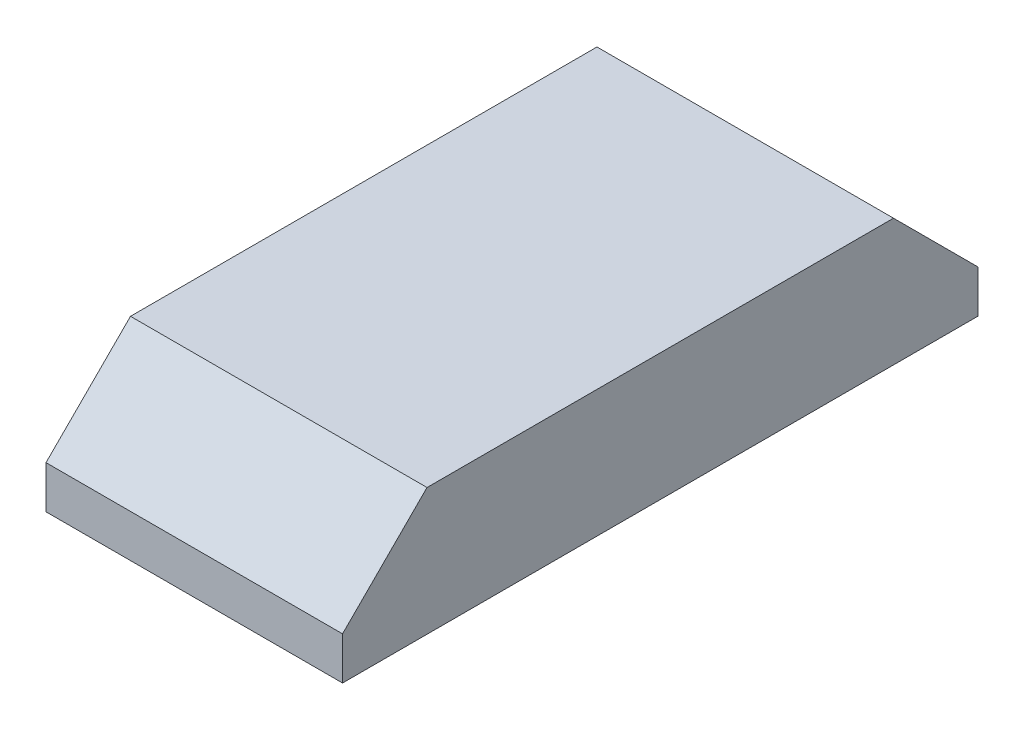
ISO-10303-21;
HEADER;
FILE_DESCRIPTION(('STEP AP214'),'2;1');
FILE_NAME('part.step','',(''),(''),'','','');
FILE_SCHEMA(('AUTOMOTIVE_DESIGN { 1 0 10303 214 1 1 1 1 }'));
ENDSEC;
DATA;
#1=APPLICATION_CONTEXT('core data for automotive mechanical design processes');
#2=APPLICATION_PROTOCOL_DEFINITION('international standard','automotive_design',2000,#1);
#3=PRODUCT_CONTEXT('',#1,'mechanical');
#4=PRODUCT('Part','Part','',(#3));
#5=PRODUCT_RELATED_PRODUCT_CATEGORY('part','',(#4));
#6=PRODUCT_DEFINITION_FORMATION('','',#4);
#7=PRODUCT_DEFINITION_CONTEXT('part definition',#1,'design');
#8=PRODUCT_DEFINITION('design','',#6,#7);
#9=PRODUCT_DEFINITION_SHAPE('','',#8);
#10=(LENGTH_UNIT() NAMED_UNIT(*) SI_UNIT(.MILLI.,.METRE.));
#11=(NAMED_UNIT(*) PLANE_ANGLE_UNIT() SI_UNIT($,.RADIAN.));
#12=(NAMED_UNIT(*) SI_UNIT($,.STERADIAN.) SOLID_ANGLE_UNIT());
#13=UNCERTAINTY_MEASURE_WITH_UNIT(LENGTH_MEASURE(1.E-05),#10,'distance_accuracy_value','');
#14=(GEOMETRIC_REPRESENTATION_CONTEXT(3) GLOBAL_UNCERTAINTY_ASSIGNED_CONTEXT((#13)) GLOBAL_UNIT_ASSIGNED_CONTEXT((#10,
#11,#12)) REPRESENTATION_CONTEXT('',''));
#15=CARTESIAN_POINT('',(0.,0.,0.));
#16=DIRECTION('',(0.,0.,1.));
#17=DIRECTION('',(1.,0.,0.));
#18=AXIS2_PLACEMENT_3D('',#15,#16,#17);
#19=CARTESIAN_POINT('',(0.,38.1,190.5));
#20=DIRECTION('',(0.,0.,-1.));
#21=DIRECTION('',(-1.,0.,0.));
#22=AXIS2_PLACEMENT_3D('',#19,#20,#21);
#23=PLANE('',#22);
#24=DIRECTION('',(1.,0.,0.));
#25=VECTOR('',#24,1.);
#26=CARTESIAN_POINT('',(0.,12.7728457875879,190.5));
#27=LINE('',#26,#25);
#28=CARTESIAN_POINT('',(0.,12.7728457875879,190.5));
#29=VERTEX_POINT('',#28);
#30=CARTESIAN_POINT('',(88.9,12.7728457875879,190.5));
#31=VERTEX_POINT('',#30);
#32=EDGE_CURVE('E95',#29,#31,#27,.T.);
#33=ORIENTED_EDGE('',*,*,#32,.F.);
#34=DIRECTION('',(0.,-1.,0.));
#35=VECTOR('',#34,1.);
#36=CARTESIAN_POINT('',(0.,38.1,190.5));
#37=LINE('',#36,#35);
#38=CARTESIAN_POINT('',(0.,0.,190.5));
#39=VERTEX_POINT('',#38);
#40=EDGE_CURVE('E11',#29,#39,#37,.T.);
#41=ORIENTED_EDGE('',*,*,#40,.T.);
#42=DIRECTION('',(1.,0.,0.));
#43=VECTOR('',#42,1.);
#44=CARTESIAN_POINT('',(0.,0.,190.5));
#45=LINE('',#44,#43);
#46=CARTESIAN_POINT('',(88.9,0.,190.5));
#47=VERTEX_POINT('',#46);
#48=EDGE_CURVE('E115',#39,#47,#45,.T.);
#49=ORIENTED_EDGE('',*,*,#48,.T.);
#50=DIRECTION('',(0.,-1.,0.));
#51=VECTOR('',#50,1.);
#52=CARTESIAN_POINT('',(88.9,38.1,190.5));
#53=LINE('',#52,#51);
#54=EDGE_CURVE('E50',#31,#47,#53,.T.);
#55=ORIENTED_EDGE('',*,*,#54,.F.);
#56=EDGE_LOOP('',(#33,#41,#49,#55));
#57=FACE_BOUND('',#56,.T.);
#58=ADVANCED_FACE('F39',(#57),#23,.F.);
#59=CARTESIAN_POINT('',(88.9,38.1,0.));
#60=DIRECTION('',(-1.,0.,0.));
#61=DIRECTION('',(0.,0.,1.));
#62=AXIS2_PLACEMENT_3D('',#59,#60,#61);
#63=PLANE('',#62);
#64=DIRECTION('',(0.,0.707106781186556,-0.707106781186539));
#65=VECTOR('',#64,1.);
#66=CARTESIAN_POINT('',(88.9,12.7728457875879,190.5));
#67=LINE('',#66,#65);
#68=CARTESIAN_POINT('',(88.9,38.1,165.172845787588));
#69=VERTEX_POINT('',#68);
#70=EDGE_CURVE('E53',#31,#69,#67,.T.);
#71=ORIENTED_EDGE('',*,*,#70,.F.);
#72=ORIENTED_EDGE('',*,*,#54,.T.);
#73=DIRECTION('',(0.,0.,-1.));
#74=VECTOR('',#73,1.);
#75=CARTESIAN_POINT('',(88.9,0.,0.));
#76=LINE('',#75,#74);
#77=CARTESIAN_POINT('',(88.9,0.,0.));
#78=VERTEX_POINT('',#77);
#79=EDGE_CURVE('E111',#47,#78,#76,.T.);
#80=ORIENTED_EDGE('',*,*,#79,.T.);
#81=DIRECTION('',(0.,-1.,0.));
#82=VECTOR('',#81,1.);
#83=CARTESIAN_POINT('',(88.9,38.1,0.));
#84=LINE('',#83,#82);
#85=CARTESIAN_POINT('',(88.9,12.7728457875879,0.));
#86=VERTEX_POINT('',#85);
#87=EDGE_CURVE('E130',#86,#78,#84,.T.);
#88=ORIENTED_EDGE('',*,*,#87,.F.);
#89=DIRECTION('',(0.,-0.707106781186544,-0.707106781186551));
#90=VECTOR('',#89,1.);
#91=CARTESIAN_POINT('',(88.9,12.7728457875879,0.));
#92=LINE('',#91,#90);
#93=CARTESIAN_POINT('',(88.9,38.1,25.3271542124124));
#94=VERTEX_POINT('',#93);
#95=EDGE_CURVE('E138',#94,#86,#92,.T.);
#96=ORIENTED_EDGE('',*,*,#95,.F.);
#97=DIRECTION('',(0.,0.,-1.));
#98=VECTOR('',#97,1.);
#99=CARTESIAN_POINT('',(88.9,38.1,0.));
#100=LINE('',#99,#98);
#101=EDGE_CURVE('E119',#69,#94,#100,.T.);
#102=ORIENTED_EDGE('',*,*,#101,.F.);
#103=EDGE_LOOP('',(#71,#72,#80,#88,#96,#102));
#104=FACE_BOUND('',#103,.T.);
#105=ADVANCED_FACE('F129',(#104),#63,.F.);
#106=CARTESIAN_POINT('',(0.,38.1,0.));
#107=DIRECTION('',(0.,1.,0.));
#108=DIRECTION('',(0.,0.,1.));
#109=AXIS2_PLACEMENT_3D('',#106,#107,#108);
#110=PLANE('',#109);
#111=DIRECTION('',(0.,0.,1.));
#112=VECTOR('',#111,1.);
#113=CARTESIAN_POINT('',(0.,38.1,0.));
#114=LINE('',#113,#112);
#115=CARTESIAN_POINT('',(0.,38.1,25.3271542124124));
#116=VERTEX_POINT('',#115);
#117=CARTESIAN_POINT('',(0.,38.1,165.172845787588));
#118=VERTEX_POINT('',#117);
#119=EDGE_CURVE('E125',#116,#118,#114,.T.);
#120=ORIENTED_EDGE('',*,*,#119,.T.);
#121=DIRECTION('',(1.,0.,0.));
#122=VECTOR('',#121,1.);
#123=CARTESIAN_POINT('',(0.,38.1,165.172845787588));
#124=LINE('',#123,#122);
#125=EDGE_CURVE('E91',#118,#69,#124,.T.);
#126=ORIENTED_EDGE('',*,*,#125,.T.);
#127=ORIENTED_EDGE('',*,*,#101,.T.);
#128=DIRECTION('',(1.,0.,0.));
#129=VECTOR('',#128,1.);
#130=CARTESIAN_POINT('',(0.,38.1,25.3271542124124));
#131=LINE('',#130,#129);
#132=EDGE_CURVE('E145',#116,#94,#131,.T.);
#133=ORIENTED_EDGE('',*,*,#132,.F.);
#134=EDGE_LOOP('',(#120,#126,#127,#133));
#135=FACE_BOUND('',#134,.T.);
#136=ADVANCED_FACE('F141',(#135),#110,.T.);
#137=CARTESIAN_POINT('',(0.,38.1,0.));
#138=DIRECTION('',(1.,0.,0.));
#139=DIRECTION('',(0.,0.,-1.));
#140=AXIS2_PLACEMENT_3D('',#137,#138,#139);
#141=PLANE('',#140);
#142=ORIENTED_EDGE('',*,*,#40,.F.);
#143=DIRECTION('',(0.,0.707106781186556,-0.707106781186539));
#144=VECTOR('',#143,1.);
#145=CARTESIAN_POINT('',(0.,12.7728457875879,190.5));
#146=LINE('',#145,#144);
#147=EDGE_CURVE('E90',#29,#118,#146,.T.);
#148=ORIENTED_EDGE('',*,*,#147,.T.);
#149=ORIENTED_EDGE('',*,*,#119,.F.);
#150=DIRECTION('',(0.,-0.707106781186544,-0.707106781186551));
#151=VECTOR('',#150,1.);
#152=CARTESIAN_POINT('',(0.,12.7728457875879,0.));
#153=LINE('',#152,#151);
#154=CARTESIAN_POINT('',(0.,12.7728457875879,0.));
#155=VERTEX_POINT('',#154);
#156=EDGE_CURVE('E65',#116,#155,#153,.T.);
#157=ORIENTED_EDGE('',*,*,#156,.T.);
#158=DIRECTION('',(0.,-1.,0.));
#159=VECTOR('',#158,1.);
#160=CARTESIAN_POINT('',(0.,38.1,0.));
#161=LINE('',#160,#159);
#162=CARTESIAN_POINT('',(0.,0.,0.));
#163=VERTEX_POINT('',#162);
#164=EDGE_CURVE('E107',#155,#163,#161,.T.);
#165=ORIENTED_EDGE('',*,*,#164,.T.);
#166=DIRECTION('',(0.,0.,1.));
#167=VECTOR('',#166,1.);
#168=CARTESIAN_POINT('',(0.,0.,0.));
#169=LINE('',#168,#167);
#170=EDGE_CURVE('E106',#163,#39,#169,.T.);
#171=ORIENTED_EDGE('',*,*,#170,.T.);
#172=EDGE_LOOP('',(#142,#148,#149,#157,#165,#171));
#173=FACE_BOUND('',#172,.T.);
#174=ADVANCED_FACE('F41',(#173),#141,.F.);
#175=CARTESIAN_POINT('',(0.,38.1,0.));
#176=DIRECTION('',(0.,0.,1.));
#177=DIRECTION('',(1.,0.,0.));
#178=AXIS2_PLACEMENT_3D('',#175,#176,#177);
#179=PLANE('',#178);
#180=ORIENTED_EDGE('',*,*,#164,.F.);
#181=DIRECTION('',(1.,0.,0.));
#182=VECTOR('',#181,1.);
#183=CARTESIAN_POINT('',(0.,12.7728457875879,0.));
#184=LINE('',#183,#182);
#185=EDGE_CURVE('E137',#155,#86,#184,.T.);
#186=ORIENTED_EDGE('',*,*,#185,.T.);
#187=ORIENTED_EDGE('',*,*,#87,.T.);
#188=DIRECTION('',(-1.,0.,0.));
#189=VECTOR('',#188,1.);
#190=CARTESIAN_POINT('',(0.,0.,0.));
#191=LINE('',#190,#189);
#192=EDGE_CURVE('E124',#78,#163,#191,.T.);
#193=ORIENTED_EDGE('',*,*,#192,.T.);
#194=EDGE_LOOP('',(#180,#186,#187,#193));
#195=FACE_BOUND('',#194,.T.);
#196=ADVANCED_FACE('F133',(#195),#179,.F.);
#197=CARTESIAN_POINT('',(0.,0.,0.));
#198=DIRECTION('',(0.,1.,0.));
#199=DIRECTION('',(0.,0.,1.));
#200=AXIS2_PLACEMENT_3D('',#197,#198,#199);
#201=PLANE('',#200);
#202=ORIENTED_EDGE('',*,*,#170,.F.);
#203=ORIENTED_EDGE('',*,*,#192,.F.);
#204=ORIENTED_EDGE('',*,*,#79,.F.);
#205=ORIENTED_EDGE('',*,*,#48,.F.);
#206=EDGE_LOOP('',(#202,#203,#204,#205));
#207=FACE_BOUND('',#206,.T.);
#208=ADVANCED_FACE('F134',(#207),#201,.F.);
#209=CARTESIAN_POINT('',(0.,12.7728457875879,0.));
#210=DIRECTION('',(0.,-0.707106781186551,0.707106781186544));
#211=DIRECTION('',(0.,-0.707106781186544,-0.707106781186551));
#212=AXIS2_PLACEMENT_3D('',#209,#210,#211);
#213=PLANE('',#212);
#214=ORIENTED_EDGE('',*,*,#95,.T.);
#215=ORIENTED_EDGE('',*,*,#185,.F.);
#216=ORIENTED_EDGE('',*,*,#156,.F.);
#217=ORIENTED_EDGE('',*,*,#132,.T.);
#218=EDGE_LOOP('',(#214,#215,#216,#217));
#219=FACE_BOUND('',#218,.T.);
#220=ADVANCED_FACE('F149',(#219),#213,.F.);
#221=CARTESIAN_POINT('',(0.,12.7728457875879,190.5));
#222=DIRECTION('',(0.,-0.707106781186539,-0.707106781186556));
#223=DIRECTION('',(0.,0.707106781186556,-0.707106781186539));
#224=AXIS2_PLACEMENT_3D('',#221,#222,#223);
#225=PLANE('',#224);
#226=ORIENTED_EDGE('',*,*,#70,.T.);
#227=ORIENTED_EDGE('',*,*,#125,.F.);
#228=ORIENTED_EDGE('',*,*,#147,.F.);
#229=ORIENTED_EDGE('',*,*,#32,.T.);
#230=EDGE_LOOP('',(#226,#227,#228,#229));
#231=FACE_BOUND('',#230,.T.);
#232=ADVANCED_FACE('F93',(#231),#225,.F.);
#233=CLOSED_SHELL('',(#58,#105,#136,#174,#196,#208,#220,#232));
#234=MANIFOLD_SOLID_BREP('B2',#233);
#235=ADVANCED_BREP_SHAPE_REPRESENTATION('',(#18,#234),#14);
#236=SHAPE_DEFINITION_REPRESENTATION(#9,#235);
ENDSEC;
END-ISO-10303-21;
